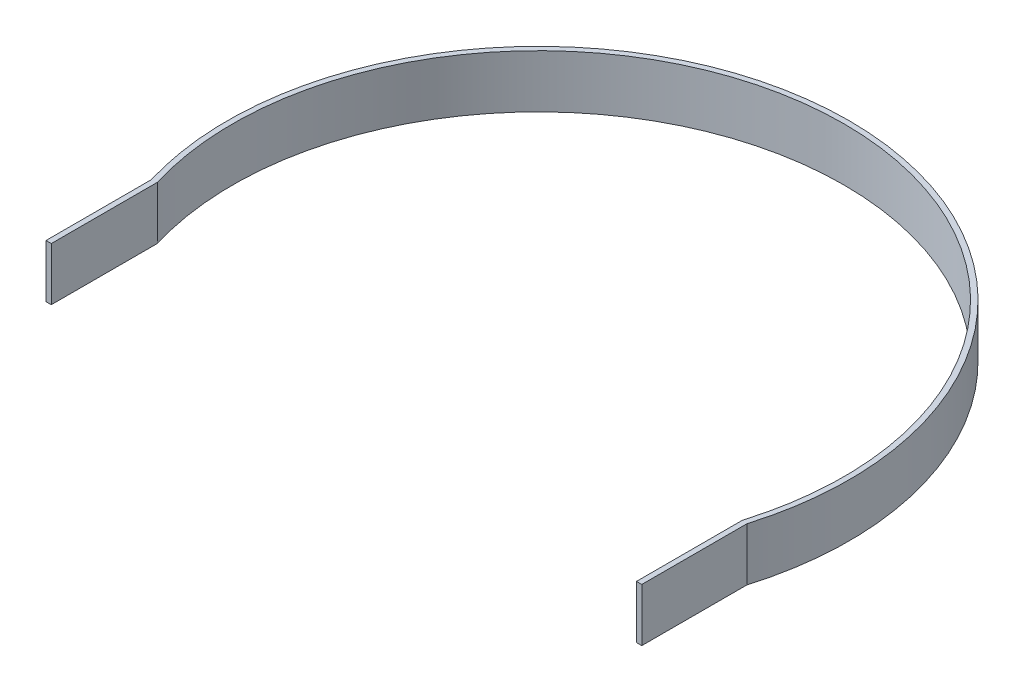
ISO-10303-21;
HEADER;
FILE_DESCRIPTION(('STEP AP214'),'2;1');
FILE_NAME('part.step','',(''),(''),'','','');
FILE_SCHEMA(('AUTOMOTIVE_DESIGN { 1 0 10303 214 1 1 1 1 }'));
ENDSEC;
DATA;
#1=APPLICATION_CONTEXT('core data for automotive mechanical design processes');
#2=APPLICATION_PROTOCOL_DEFINITION('international standard','automotive_design',2000,#1);
#3=PRODUCT_CONTEXT('',#1,'mechanical');
#4=PRODUCT('Part','Part','',(#3));
#5=PRODUCT_RELATED_PRODUCT_CATEGORY('part','',(#4));
#6=PRODUCT_DEFINITION_FORMATION('','',#4);
#7=PRODUCT_DEFINITION_CONTEXT('part definition',#1,'design');
#8=PRODUCT_DEFINITION('design','',#6,#7);
#9=PRODUCT_DEFINITION_SHAPE('','',#8);
#10=(LENGTH_UNIT() NAMED_UNIT(*) SI_UNIT(.MILLI.,.METRE.));
#11=(NAMED_UNIT(*) PLANE_ANGLE_UNIT() SI_UNIT($,.RADIAN.));
#12=(NAMED_UNIT(*) SI_UNIT($,.STERADIAN.) SOLID_ANGLE_UNIT());
#13=UNCERTAINTY_MEASURE_WITH_UNIT(LENGTH_MEASURE(1.E-05),#10,'distance_accuracy_value','');
#14=(GEOMETRIC_REPRESENTATION_CONTEXT(3) GLOBAL_UNCERTAINTY_ASSIGNED_CONTEXT((#13)) GLOBAL_UNIT_ASSIGNED_CONTEXT((#10,
#11,#12)) REPRESENTATION_CONTEXT('',''));
#15=CARTESIAN_POINT('',(0.,0.,0.));
#16=DIRECTION('',(0.,0.,1.));
#17=DIRECTION('',(1.,0.,0.));
#18=AXIS2_PLACEMENT_3D('',#15,#16,#17);
#19=CARTESIAN_POINT('',(-56.2,5.,16.6787104614673));
#20=DIRECTION('',(1.,0.,0.));
#21=DIRECTION('',(0.,0.,-1.));
#22=AXIS2_PLACEMENT_3D('',#19,#20,#21);
#23=PLANE('',#22);
#24=DIRECTION('',(0.,0.,-1.));
#25=VECTOR('',#24,1.);
#26=CARTESIAN_POINT('',(-56.2,-5.,16.6787104614673));
#27=LINE('',#26,#25);
#28=CARTESIAN_POINT('',(-56.2,-5.,16.8258376647108));
#29=VERTEX_POINT('',#28);
#30=CARTESIAN_POINT('',(-56.2,-5.,36.6787104614673));
#31=VERTEX_POINT('',#30);
#32=EDGE_CURVE('E134',#29,#31,#27,.F.);
#33=ORIENTED_EDGE('',*,*,#32,.T.);
#34=DIRECTION('',(0.,-1.,0.));
#35=VECTOR('',#34,1.);
#36=CARTESIAN_POINT('',(-56.2,5.,36.6787104614673));
#37=LINE('',#36,#35);
#38=CARTESIAN_POINT('',(-56.2,5.,36.6787104614673));
#39=VERTEX_POINT('',#38);
#40=EDGE_CURVE('E11',#39,#31,#37,.T.);
#41=ORIENTED_EDGE('',*,*,#40,.F.);
#42=DIRECTION('',(0.,0.,-1.));
#43=VECTOR('',#42,1.);
#44=CARTESIAN_POINT('',(-56.2,5.,16.6787104614673));
#45=LINE('',#44,#43);
#46=CARTESIAN_POINT('',(-56.2,5.,16.8258376647108));
#47=VERTEX_POINT('',#46);
#48=EDGE_CURVE('E92',#47,#39,#45,.F.);
#49=ORIENTED_EDGE('',*,*,#48,.F.);
#50=DIRECTION('',(0.,-1.,0.));
#51=VECTOR('',#50,1.);
#52=CARTESIAN_POINT('',(-56.2,5.,16.8258376647108));
#53=LINE('',#52,#51);
#54=EDGE_CURVE('E133',#47,#29,#53,.T.);
#55=ORIENTED_EDGE('',*,*,#54,.T.);
#56=EDGE_LOOP('',(#33,#41,#49,#55));
#57=FACE_BOUND('',#56,.T.);
#58=ADVANCED_FACE('F37',(#57),#23,.F.);
#59=CARTESIAN_POINT('',(-55.2,5.,36.6787104614673));
#60=DIRECTION('',(0.,0.,1.));
#61=DIRECTION('',(1.,0.,0.));
#62=AXIS2_PLACEMENT_3D('',#59,#60,#61);
#63=PLANE('',#62);
#64=DIRECTION('',(-1.,0.,0.));
#65=VECTOR('',#64,1.);
#66=CARTESIAN_POINT('',(-55.2,-5.,36.6787104614673));
#67=LINE('',#66,#65);
#68=CARTESIAN_POINT('',(-55.2,-5.,36.6787104614673));
#69=VERTEX_POINT('',#68);
#70=EDGE_CURVE('E137',#69,#31,#67,.T.);
#71=ORIENTED_EDGE('',*,*,#70,.F.);
#72=DIRECTION('',(0.,-1.,0.));
#73=VECTOR('',#72,1.);
#74=CARTESIAN_POINT('',(-55.2,5.,36.6787104614673));
#75=LINE('',#74,#73);
#76=CARTESIAN_POINT('',(-55.2,5.,36.6787104614673));
#77=VERTEX_POINT('',#76);
#78=EDGE_CURVE('E45',#77,#69,#75,.T.);
#79=ORIENTED_EDGE('',*,*,#78,.F.);
#80=DIRECTION('',(-1.,0.,0.));
#81=VECTOR('',#80,1.);
#82=CARTESIAN_POINT('',(-55.2,5.,36.6787104614673));
#83=LINE('',#82,#81);
#84=EDGE_CURVE('E176',#77,#39,#83,.T.);
#85=ORIENTED_EDGE('',*,*,#84,.T.);
#86=ORIENTED_EDGE('',*,*,#40,.T.);
#87=EDGE_LOOP('',(#71,#79,#85,#86));
#88=FACE_BOUND('',#87,.T.);
#89=ADVANCED_FACE('F167',(#88),#63,.T.);
#90=CARTESIAN_POINT('',(-55.2,5.,16.6787104614673));
#91=DIRECTION('',(1.,0.,0.));
#92=DIRECTION('',(0.,0.,-1.));
#93=AXIS2_PLACEMENT_3D('',#90,#91,#92);
#94=PLANE('',#93);
#95=DIRECTION('',(0.,0.,1.));
#96=VECTOR('',#95,1.);
#97=CARTESIAN_POINT('',(-55.2,-5.,16.6787104614673));
#98=LINE('',#97,#96);
#99=CARTESIAN_POINT('',(-55.2,-5.,16.6787104614673));
#100=VERTEX_POINT('',#99);
#101=EDGE_CURVE('E140',#100,#69,#98,.T.);
#102=ORIENTED_EDGE('',*,*,#101,.F.);
#103=DIRECTION('',(0.,-1.,0.));
#104=VECTOR('',#103,1.);
#105=CARTESIAN_POINT('',(-55.2,5.,16.6787104614673));
#106=LINE('',#105,#104);
#107=CARTESIAN_POINT('',(-55.2,5.,16.6787104614673));
#108=VERTEX_POINT('',#107);
#109=EDGE_CURVE('E157',#108,#100,#106,.T.);
#110=ORIENTED_EDGE('',*,*,#109,.F.);
#111=DIRECTION('',(0.,0.,1.));
#112=VECTOR('',#111,1.);
#113=CARTESIAN_POINT('',(-55.2,5.,16.6787104614673));
#114=LINE('',#113,#112);
#115=EDGE_CURVE('E164',#108,#77,#114,.T.);
#116=ORIENTED_EDGE('',*,*,#115,.T.);
#117=ORIENTED_EDGE('',*,*,#78,.T.);
#118=EDGE_LOOP('',(#102,#110,#116,#117));
#119=FACE_BOUND('',#118,.T.);
#120=ADVANCED_FACE('F162',(#119),#94,.T.);
#121=CARTESIAN_POINT('',(0.,5.,0.));
#122=DIRECTION('',(0.,-1.,0.));
#123=DIRECTION('',(0.,0.,-1.));
#124=AXIS2_PLACEMENT_3D('',#121,#122,#123);
#125=CYLINDRICAL_SURFACE('',#124,57.6647152308711);
#126=CARTESIAN_POINT('',(0.,-5.,0.));
#127=DIRECTION('',(0.,1.,0.));
#128=DIRECTION('',(0.,0.,-1.));
#129=AXIS2_PLACEMENT_3D('',#126,#127,#128);
#130=CIRCLE('',#129,57.6647152308711);
#131=CARTESIAN_POINT('',(55.2,-5.,16.6787104614673));
#132=VERTEX_POINT('',#131);
#133=EDGE_CURVE('E143',#132,#100,#130,.T.);
#134=ORIENTED_EDGE('',*,*,#133,.F.);
#135=DIRECTION('',(0.,-1.,0.));
#136=VECTOR('',#135,1.);
#137=CARTESIAN_POINT('',(55.2,5.,16.6787104614673));
#138=LINE('',#137,#136);
#139=CARTESIAN_POINT('',(55.2,5.,16.6787104614673));
#140=VERTEX_POINT('',#139);
#141=EDGE_CURVE('E155',#140,#132,#138,.T.);
#142=ORIENTED_EDGE('',*,*,#141,.F.);
#143=CARTESIAN_POINT('',(0.,5.,0.));
#144=DIRECTION('',(0.,1.,0.));
#145=DIRECTION('',(0.,0.,-1.));
#146=AXIS2_PLACEMENT_3D('',#143,#144,#145);
#147=CIRCLE('',#146,57.6647152308711);
#148=EDGE_CURVE('E128',#140,#108,#147,.T.);
#149=ORIENTED_EDGE('',*,*,#148,.T.);
#150=ORIENTED_EDGE('',*,*,#109,.T.);
#151=EDGE_LOOP('',(#134,#142,#149,#150));
#152=FACE_BOUND('',#151,.T.);
#153=ADVANCED_FACE('F174',(#152),#125,.F.);
#154=CARTESIAN_POINT('',(55.2,5.,16.6787104614673));
#155=DIRECTION('',(-1.,0.,0.));
#156=DIRECTION('',(0.,0.,1.));
#157=AXIS2_PLACEMENT_3D('',#154,#155,#156);
#158=PLANE('',#157);
#159=DIRECTION('',(0.,0.,-1.));
#160=VECTOR('',#159,1.);
#161=CARTESIAN_POINT('',(55.2,-5.,16.6787104614673));
#162=LINE('',#161,#160);
#163=CARTESIAN_POINT('',(55.2,-5.,36.6787104614673));
#164=VERTEX_POINT('',#163);
#165=EDGE_CURVE('E146',#164,#132,#162,.T.);
#166=ORIENTED_EDGE('',*,*,#165,.F.);
#167=DIRECTION('',(0.,-1.,0.));
#168=VECTOR('',#167,1.);
#169=CARTESIAN_POINT('',(55.2,5.,36.6787104614673));
#170=LINE('',#169,#168);
#171=CARTESIAN_POINT('',(55.2,5.,36.6787104614673));
#172=VERTEX_POINT('',#171);
#173=EDGE_CURVE('E116',#172,#164,#170,.T.);
#174=ORIENTED_EDGE('',*,*,#173,.F.);
#175=DIRECTION('',(0.,0.,-1.));
#176=VECTOR('',#175,1.);
#177=CARTESIAN_POINT('',(55.2,5.,16.6787104614673));
#178=LINE('',#177,#176);
#179=EDGE_CURVE('E126',#172,#140,#178,.T.);
#180=ORIENTED_EDGE('',*,*,#179,.T.);
#181=ORIENTED_EDGE('',*,*,#141,.T.);
#182=EDGE_LOOP('',(#166,#174,#180,#181));
#183=FACE_BOUND('',#182,.T.);
#184=ADVANCED_FACE('F181',(#183),#158,.T.);
#185=CARTESIAN_POINT('',(56.2,5.,36.6787104614673));
#186=DIRECTION('',(0.,0.,1.));
#187=DIRECTION('',(1.,0.,0.));
#188=AXIS2_PLACEMENT_3D('',#185,#186,#187);
#189=PLANE('',#188);
#190=DIRECTION('',(-1.,0.,0.));
#191=VECTOR('',#190,1.);
#192=CARTESIAN_POINT('',(56.2,-5.,36.6787104614673));
#193=LINE('',#192,#191);
#194=CARTESIAN_POINT('',(56.2,-5.,36.6787104614673));
#195=VERTEX_POINT('',#194);
#196=EDGE_CURVE('E115',#195,#164,#193,.T.);
#197=ORIENTED_EDGE('',*,*,#196,.F.);
#198=DIRECTION('',(0.,-1.,0.));
#199=VECTOR('',#198,1.);
#200=CARTESIAN_POINT('',(56.2,5.,36.6787104614673));
#201=LINE('',#200,#199);
#202=CARTESIAN_POINT('',(56.2,5.,36.6787104614673));
#203=VERTEX_POINT('',#202);
#204=EDGE_CURVE('E109',#203,#195,#201,.T.);
#205=ORIENTED_EDGE('',*,*,#204,.F.);
#206=DIRECTION('',(-1.,0.,0.));
#207=VECTOR('',#206,1.);
#208=CARTESIAN_POINT('',(56.2,5.,36.6787104614673));
#209=LINE('',#208,#207);
#210=EDGE_CURVE('E113',#203,#172,#209,.T.);
#211=ORIENTED_EDGE('',*,*,#210,.T.);
#212=ORIENTED_EDGE('',*,*,#173,.T.);
#213=EDGE_LOOP('',(#197,#205,#211,#212));
#214=FACE_BOUND('',#213,.T.);
#215=ADVANCED_FACE('F111',(#214),#189,.T.);
#216=CARTESIAN_POINT('',(56.2,5.,16.6787104614673));
#217=DIRECTION('',(-1.,0.,0.));
#218=DIRECTION('',(0.,0.,1.));
#219=AXIS2_PLACEMENT_3D('',#216,#217,#218);
#220=PLANE('',#219);
#221=DIRECTION('',(0.,0.,-1.));
#222=VECTOR('',#221,1.);
#223=CARTESIAN_POINT('',(56.2,-5.,16.6787104614673));
#224=LINE('',#223,#222);
#225=CARTESIAN_POINT('',(56.2,-5.,16.8258376647108));
#226=VERTEX_POINT('',#225);
#227=EDGE_CURVE('E80',#195,#226,#224,.T.);
#228=ORIENTED_EDGE('',*,*,#227,.T.);
#229=DIRECTION('',(0.,-1.,0.));
#230=VECTOR('',#229,1.);
#231=CARTESIAN_POINT('',(56.2,5.,16.8258376647108));
#232=LINE('',#231,#230);
#233=CARTESIAN_POINT('',(56.2,5.,16.8258376647108));
#234=VERTEX_POINT('',#233);
#235=EDGE_CURVE('E117',#234,#226,#232,.T.);
#236=ORIENTED_EDGE('',*,*,#235,.F.);
#237=DIRECTION('',(0.,0.,-1.));
#238=VECTOR('',#237,1.);
#239=CARTESIAN_POINT('',(56.2,5.,16.6787104614673));
#240=LINE('',#239,#238);
#241=EDGE_CURVE('E119',#203,#234,#240,.T.);
#242=ORIENTED_EDGE('',*,*,#241,.F.);
#243=ORIENTED_EDGE('',*,*,#204,.T.);
#244=EDGE_LOOP('',(#228,#236,#242,#243));
#245=FACE_BOUND('',#244,.T.);
#246=ADVANCED_FACE('F120',(#245),#220,.F.);
#247=CARTESIAN_POINT('',(0.,5.,0.));
#248=DIRECTION('',(0.,-1.,0.));
#249=DIRECTION('',(0.,0.,-1.));
#250=AXIS2_PLACEMENT_3D('',#247,#248,#249);
#251=CYLINDRICAL_SURFACE('',#250,58.6647152308711);
#252=CARTESIAN_POINT('',(0.,-5.,0.));
#253=DIRECTION('',(0.,1.,0.));
#254=DIRECTION('',(1.,0.,0.));
#255=AXIS2_PLACEMENT_3D('',#252,#253,#254);
#256=CIRCLE('',#255,58.6647152308711);
#257=EDGE_CURVE('E86',#226,#29,#256,.T.);
#258=ORIENTED_EDGE('',*,*,#257,.T.);
#259=ORIENTED_EDGE('',*,*,#54,.F.);
#260=CARTESIAN_POINT('',(0.,5.,0.));
#261=DIRECTION('',(0.,1.,0.));
#262=DIRECTION('',(1.,0.,0.));
#263=AXIS2_PLACEMENT_3D('',#260,#261,#262);
#264=CIRCLE('',#263,58.6647152308711);
#265=EDGE_CURVE('E53',#234,#47,#264,.T.);
#266=ORIENTED_EDGE('',*,*,#265,.F.);
#267=ORIENTED_EDGE('',*,*,#235,.T.);
#268=EDGE_LOOP('',(#258,#259,#266,#267));
#269=FACE_BOUND('',#268,.T.);
#270=ADVANCED_FACE('F183',(#269),#251,.T.);
#271=CARTESIAN_POINT('',(0.,5.,0.));
#272=DIRECTION('',(0.,1.,0.));
#273=DIRECTION('',(1.,0.,0.));
#274=AXIS2_PLACEMENT_3D('',#271,#272,#273);
#275=PLANE('',#274);
#276=ORIENTED_EDGE('',*,*,#48,.T.);
#277=ORIENTED_EDGE('',*,*,#84,.F.);
#278=ORIENTED_EDGE('',*,*,#115,.F.);
#279=ORIENTED_EDGE('',*,*,#148,.F.);
#280=ORIENTED_EDGE('',*,*,#179,.F.);
#281=ORIENTED_EDGE('',*,*,#210,.F.);
#282=ORIENTED_EDGE('',*,*,#241,.T.);
#283=ORIENTED_EDGE('',*,*,#265,.T.);
#284=EDGE_LOOP('',(#276,#277,#278,#279,#280,#281,#282,#283));
#285=FACE_BOUND('',#284,.T.);
#286=ADVANCED_FACE('F123',(#285),#275,.T.);
#287=CARTESIAN_POINT('',(0.,-5.,0.));
#288=DIRECTION('',(0.,1.,0.));
#289=DIRECTION('',(1.,0.,0.));
#290=AXIS2_PLACEMENT_3D('',#287,#288,#289);
#291=PLANE('',#290);
#292=ORIENTED_EDGE('',*,*,#32,.F.);
#293=ORIENTED_EDGE('',*,*,#257,.F.);
#294=ORIENTED_EDGE('',*,*,#227,.F.);
#295=ORIENTED_EDGE('',*,*,#196,.T.);
#296=ORIENTED_EDGE('',*,*,#165,.T.);
#297=ORIENTED_EDGE('',*,*,#133,.T.);
#298=ORIENTED_EDGE('',*,*,#101,.T.);
#299=ORIENTED_EDGE('',*,*,#70,.T.);
#300=EDGE_LOOP('',(#292,#293,#294,#295,#296,#297,#298,#299));
#301=FACE_BOUND('',#300,.T.);
#302=ADVANCED_FACE('F170',(#301),#291,.F.);
#303=CLOSED_SHELL('',(#58,#89,#120,#153,#184,#215,#246,#270,#286,#302));
#304=MANIFOLD_SOLID_BREP('B2',#303);
#305=ADVANCED_BREP_SHAPE_REPRESENTATION('',(#18,#304),#14);
#306=SHAPE_DEFINITION_REPRESENTATION(#9,#305);
ENDSEC;
END-ISO-10303-21;
